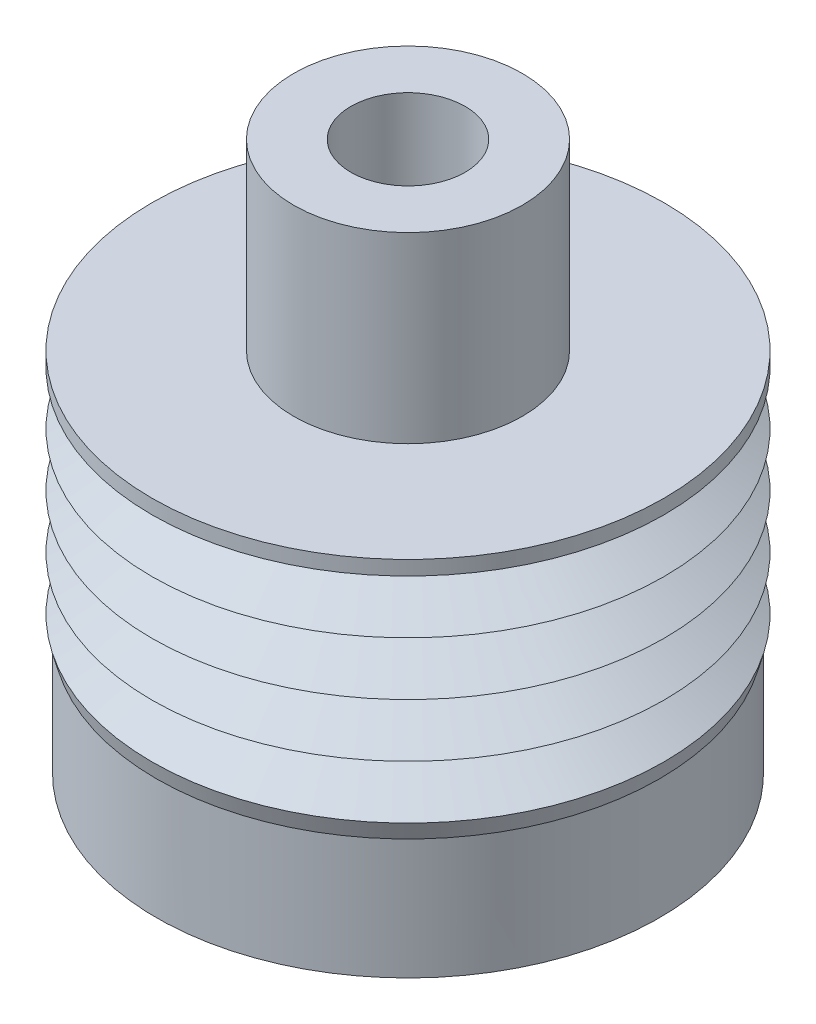
ISO-10303-21;
HEADER;
FILE_DESCRIPTION(('STEP AP214'),'2;1');
FILE_NAME('part.step','',(''),(''),'','','');
FILE_SCHEMA(('AUTOMOTIVE_DESIGN { 1 0 10303 214 1 1 1 1 }'));
ENDSEC;
DATA;
#1=APPLICATION_CONTEXT('core data for automotive mechanical design processes');
#2=APPLICATION_PROTOCOL_DEFINITION('international standard','automotive_design',2000,#1);
#3=PRODUCT_CONTEXT('',#1,'mechanical');
#4=PRODUCT('Part','Part','',(#3));
#5=PRODUCT_RELATED_PRODUCT_CATEGORY('part','',(#4));
#6=PRODUCT_DEFINITION_FORMATION('','',#4);
#7=PRODUCT_DEFINITION_CONTEXT('part definition',#1,'design');
#8=PRODUCT_DEFINITION('design','',#6,#7);
#9=PRODUCT_DEFINITION_SHAPE('','',#8);
#10=(LENGTH_UNIT() NAMED_UNIT(*) SI_UNIT(.MILLI.,.METRE.));
#11=(NAMED_UNIT(*) PLANE_ANGLE_UNIT() SI_UNIT($,.RADIAN.));
#12=(NAMED_UNIT(*) SI_UNIT($,.STERADIAN.) SOLID_ANGLE_UNIT());
#13=UNCERTAINTY_MEASURE_WITH_UNIT(LENGTH_MEASURE(1.E-05),#10,'distance_accuracy_value','');
#14=(GEOMETRIC_REPRESENTATION_CONTEXT(3) GLOBAL_UNCERTAINTY_ASSIGNED_CONTEXT((#13)) GLOBAL_UNIT_ASSIGNED_CONTEXT((#10,
#11,#12)) REPRESENTATION_CONTEXT('',''));
#15=CARTESIAN_POINT('',(0.,0.,0.));
#16=DIRECTION('',(0.,0.,1.));
#17=DIRECTION('',(1.,0.,0.));
#18=AXIS2_PLACEMENT_3D('',#15,#16,#17);
#19=CARTESIAN_POINT('',(2.5,16.,0.));
#20=DIRECTION('',(0.,1.,0.));
#21=DIRECTION('',(0.,0.,1.));
#22=AXIS2_PLACEMENT_3D('',#19,#20,#21);
#23=PLANE('',#22);
#24=CARTESIAN_POINT('',(0.,16.,0.));
#25=DIRECTION('',(0.,-1.,0.));
#26=DIRECTION('',(0.,0.,-1.));
#27=AXIS2_PLACEMENT_3D('',#24,#25,#26);
#28=CIRCLE('',#27,11.2);
#29=CARTESIAN_POINT('',(0.,16.,-11.2));
#30=VERTEX_POINT('',#29);
#31=EDGE_CURVE('E98',#30,#30,#28,.T.);
#32=ORIENTED_EDGE('',*,*,#31,.F.);
#33=EDGE_LOOP('',(#32));
#34=FACE_BOUND('',#33,.T.);
#35=CARTESIAN_POINT('',(0.,16.,0.));
#36=DIRECTION('',(0.,1.,0.));
#37=DIRECTION('',(0.,0.,1.));
#38=AXIS2_PLACEMENT_3D('',#35,#36,#37);
#39=CIRCLE('',#38,5.);
#40=CARTESIAN_POINT('',(0.,16.,5.));
#41=VERTEX_POINT('',#40);
#42=EDGE_CURVE('E107',#41,#41,#39,.T.);
#43=ORIENTED_EDGE('',*,*,#42,.F.);
#44=EDGE_LOOP('',(#43));
#45=FACE_BOUND('',#44,.T.);
#46=ADVANCED_FACE('F41',(#34,#45),#23,.T.);
#47=CARTESIAN_POINT('',(2.5,0.,0.));
#48=DIRECTION('',(0.,-1.,0.));
#49=DIRECTION('',(0.,0.,-1.));
#50=AXIS2_PLACEMENT_3D('',#47,#48,#49);
#51=PLANE('',#50);
#52=CARTESIAN_POINT('',(0.,0.,0.));
#53=DIRECTION('',(0.,-1.,0.));
#54=DIRECTION('',(0.,0.,-1.));
#55=AXIS2_PLACEMENT_3D('',#52,#53,#54);
#56=CIRCLE('',#55,11.);
#57=CARTESIAN_POINT('',(0.,0.,-11.));
#58=VERTEX_POINT('',#57);
#59=EDGE_CURVE('E55',#58,#58,#56,.T.);
#60=ORIENTED_EDGE('',*,*,#59,.T.);
#61=EDGE_LOOP('',(#60));
#62=FACE_BOUND('',#61,.T.);
#63=CARTESIAN_POINT('',(0.,0.,0.));
#64=DIRECTION('',(0.,-1.,0.));
#65=DIRECTION('',(0.,0.,-1.));
#66=AXIS2_PLACEMENT_3D('',#63,#64,#65);
#67=CIRCLE('',#66,2.5);
#68=CARTESIAN_POINT('',(0.,0.,-2.5));
#69=VERTEX_POINT('',#68);
#70=EDGE_CURVE('E102',#69,#69,#67,.T.);
#71=ORIENTED_EDGE('',*,*,#70,.F.);
#72=EDGE_LOOP('',(#71));
#73=FACE_BOUND('',#72,.T.);
#74=ADVANCED_FACE('F135',(#62,#73),#51,.T.);
#75=CARTESIAN_POINT('',(0.,0.,0.));
#76=DIRECTION('',(0.,-1.,0.));
#77=DIRECTION('',(0.,0.,-1.));
#78=AXIS2_PLACEMENT_3D('',#75,#76,#77);
#79=CYLINDRICAL_SURFACE('',#78,11.);
#80=CARTESIAN_POINT('',(0.,5.2661582604212,0.));
#81=DIRECTION('',(0.,-1.,0.));
#82=DIRECTION('',(0.,0.,-1.));
#83=AXIS2_PLACEMENT_3D('',#80,#81,#82);
#84=CIRCLE('',#83,11.);
#85=CARTESIAN_POINT('',(0.,5.2661582604212,11.));
#86=VERTEX_POINT('',#85);
#87=EDGE_CURVE('E50',#86,#86,#84,.T.);
#88=ORIENTED_EDGE('',*,*,#87,.T.);
#89=EDGE_LOOP('',(#88));
#90=FACE_BOUND('',#89,.T.);
#91=ORIENTED_EDGE('',*,*,#59,.F.);
#92=EDGE_LOOP('',(#91));
#93=FACE_BOUND('',#92,.T.);
#94=ADVANCED_FACE('F143',(#90,#93),#79,.T.);
#95=CARTESIAN_POINT('',(0.,5.89452994616205,0.));
#96=DIRECTION('',(0.,1.,0.));
#97=DIRECTION('',(0.,0.,1.));
#98=AXIS2_PLACEMENT_3D('',#95,#96,#97);
#99=CONICAL_SURFACE('',#98,11.,1.0471975511966);
#100=CARTESIAN_POINT('',(0.,6.00952994616205,0.));
#101=DIRECTION('',(0.,1.,0.));
#102=DIRECTION('',(0.,0.,1.));
#103=AXIS2_PLACEMENT_3D('',#100,#101,#102);
#104=CIRCLE('',#103,11.1991858428704);
#105=CARTESIAN_POINT('',(0.,6.00952994616205,11.1991858428704));
#106=VERTEX_POINT('',#105);
#107=EDGE_CURVE('E10',#106,#106,#104,.T.);
#108=ORIENTED_EDGE('',*,*,#107,.T.);
#109=EDGE_LOOP('',(#108));
#110=FACE_BOUND('',#109,.T.);
#111=CARTESIAN_POINT('',(0.,6.01,0.));
#112=DIRECTION('',(0.,-1.,0.));
#113=DIRECTION('',(0.,0.,-1.));
#114=AXIS2_PLACEMENT_3D('',#111,#112,#113);
#115=CIRCLE('',#114,11.2);
#116=CARTESIAN_POINT('',(0.,6.01,-11.2));
#117=VERTEX_POINT('',#116);
#118=EDGE_CURVE('E60',#117,#117,#115,.T.);
#119=ORIENTED_EDGE('',*,*,#118,.T.);
#120=EDGE_LOOP('',(#119));
#121=FACE_BOUND('',#120,.T.);
#122=ADVANCED_FACE('F184',(#110,#121),#99,.T.);
#123=CARTESIAN_POINT('',(0.,6.01,0.));
#124=DIRECTION('',(0.,-1.,0.));
#125=DIRECTION('',(0.,0.,-1.));
#126=AXIS2_PLACEMENT_3D('',#123,#124,#125);
#127=CONICAL_SURFACE('',#126,11.2,1.0471975511966);
#128=CARTESIAN_POINT('',(0.,7.18000000000001,0.));
#129=DIRECTION('',(0.,-1.,0.));
#130=DIRECTION('',(0.,0.,-1.));
#131=AXIS2_PLACEMENT_3D('',#128,#129,#130);
#132=CIRCLE('',#131,9.17350055514444);
#133=CARTESIAN_POINT('',(0.,7.18000000000001,-9.17350055514444));
#134=VERTEX_POINT('',#133);
#135=EDGE_CURVE('E66',#134,#134,#132,.T.);
#136=ORIENTED_EDGE('',*,*,#135,.T.);
#137=EDGE_LOOP('',(#136));
#138=FACE_BOUND('',#137,.T.);
#139=ORIENTED_EDGE('',*,*,#118,.F.);
#140=EDGE_LOOP('',(#139));
#141=FACE_BOUND('',#140,.T.);
#142=ADVANCED_FACE('F180',(#138,#141),#127,.T.);
#143=CARTESIAN_POINT('',(0.,7.18000000000001,0.));
#144=DIRECTION('',(0.,1.,0.));
#145=DIRECTION('',(0.,0.,1.));
#146=AXIS2_PLACEMENT_3D('',#143,#144,#145);
#147=CONICAL_SURFACE('',#146,9.17350055514444,1.0471975511966);
#148=CARTESIAN_POINT('',(0.,8.35,0.));
#149=DIRECTION('',(0.,-1.,0.));
#150=DIRECTION('',(0.,0.,-1.));
#151=AXIS2_PLACEMENT_3D('',#148,#149,#150);
#152=CIRCLE('',#151,11.2);
#153=CARTESIAN_POINT('',(0.,8.35,-11.2));
#154=VERTEX_POINT('',#153);
#155=EDGE_CURVE('E70',#154,#154,#152,.T.);
#156=ORIENTED_EDGE('',*,*,#155,.T.);
#157=EDGE_LOOP('',(#156));
#158=FACE_BOUND('',#157,.T.);
#159=ORIENTED_EDGE('',*,*,#135,.F.);
#160=EDGE_LOOP('',(#159));
#161=FACE_BOUND('',#160,.T.);
#162=ADVANCED_FACE('F176',(#158,#161),#147,.T.);
#163=CARTESIAN_POINT('',(0.,8.35,0.));
#164=DIRECTION('',(0.,-1.,0.));
#165=DIRECTION('',(0.,0.,-1.));
#166=AXIS2_PLACEMENT_3D('',#163,#164,#165);
#167=CONICAL_SURFACE('',#166,11.2,1.0471975511966);
#168=CARTESIAN_POINT('',(0.,9.52,0.));
#169=DIRECTION('',(0.,-1.,0.));
#170=DIRECTION('',(0.,0.,-1.));
#171=AXIS2_PLACEMENT_3D('',#168,#169,#170);
#172=CIRCLE('',#171,9.17350055514441);
#173=CARTESIAN_POINT('',(0.,9.52,-9.17350055514441));
#174=VERTEX_POINT('',#173);
#175=EDGE_CURVE('E74',#174,#174,#172,.T.);
#176=ORIENTED_EDGE('',*,*,#175,.T.);
#177=EDGE_LOOP('',(#176));
#178=FACE_BOUND('',#177,.T.);
#179=ORIENTED_EDGE('',*,*,#155,.F.);
#180=EDGE_LOOP('',(#179));
#181=FACE_BOUND('',#180,.T.);
#182=ADVANCED_FACE('F172',(#178,#181),#167,.T.);
#183=CARTESIAN_POINT('',(0.,9.52,0.));
#184=DIRECTION('',(0.,1.,0.));
#185=DIRECTION('',(0.,0.,1.));
#186=AXIS2_PLACEMENT_3D('',#183,#184,#185);
#187=CONICAL_SURFACE('',#186,9.17350055514441,1.0471975511966);
#188=CARTESIAN_POINT('',(0.,10.69,0.));
#189=DIRECTION('',(0.,-1.,0.));
#190=DIRECTION('',(0.,0.,-1.));
#191=AXIS2_PLACEMENT_3D('',#188,#189,#190);
#192=CIRCLE('',#191,11.2);
#193=CARTESIAN_POINT('',(0.,10.69,-11.2));
#194=VERTEX_POINT('',#193);
#195=EDGE_CURVE('E78',#194,#194,#192,.T.);
#196=ORIENTED_EDGE('',*,*,#195,.T.);
#197=EDGE_LOOP('',(#196));
#198=FACE_BOUND('',#197,.T.);
#199=ORIENTED_EDGE('',*,*,#175,.F.);
#200=EDGE_LOOP('',(#199));
#201=FACE_BOUND('',#200,.T.);
#202=ADVANCED_FACE('F168',(#198,#201),#187,.T.);
#203=CARTESIAN_POINT('',(0.,10.69,0.));
#204=DIRECTION('',(0.,-1.,0.));
#205=DIRECTION('',(0.,0.,-1.));
#206=AXIS2_PLACEMENT_3D('',#203,#204,#205);
#207=CONICAL_SURFACE('',#206,11.2,1.0471975511966);
#208=CARTESIAN_POINT('',(0.,11.86,0.));
#209=DIRECTION('',(0.,-1.,0.));
#210=DIRECTION('',(0.,0.,-1.));
#211=AXIS2_PLACEMENT_3D('',#208,#209,#210);
#212=CIRCLE('',#211,9.17350055514439);
#213=CARTESIAN_POINT('',(0.,11.86,-9.17350055514439));
#214=VERTEX_POINT('',#213);
#215=EDGE_CURVE('E82',#214,#214,#212,.T.);
#216=ORIENTED_EDGE('',*,*,#215,.T.);
#217=EDGE_LOOP('',(#216));
#218=FACE_BOUND('',#217,.T.);
#219=ORIENTED_EDGE('',*,*,#195,.F.);
#220=EDGE_LOOP('',(#219));
#221=FACE_BOUND('',#220,.T.);
#222=ADVANCED_FACE('F164',(#218,#221),#207,.T.);
#223=CARTESIAN_POINT('',(0.,11.86,0.));
#224=DIRECTION('',(0.,1.,0.));
#225=DIRECTION('',(0.,0.,1.));
#226=AXIS2_PLACEMENT_3D('',#223,#224,#225);
#227=CONICAL_SURFACE('',#226,9.17350055514439,1.0471975511966);
#228=CARTESIAN_POINT('',(0.,13.03,0.));
#229=DIRECTION('',(0.,-1.,0.));
#230=DIRECTION('',(0.,0.,-1.));
#231=AXIS2_PLACEMENT_3D('',#228,#229,#230);
#232=CIRCLE('',#231,11.2);
#233=CARTESIAN_POINT('',(0.,13.03,-11.2));
#234=VERTEX_POINT('',#233);
#235=EDGE_CURVE('E86',#234,#234,#232,.T.);
#236=ORIENTED_EDGE('',*,*,#235,.T.);
#237=EDGE_LOOP('',(#236));
#238=FACE_BOUND('',#237,.T.);
#239=ORIENTED_EDGE('',*,*,#215,.F.);
#240=EDGE_LOOP('',(#239));
#241=FACE_BOUND('',#240,.T.);
#242=ADVANCED_FACE('F160',(#238,#241),#227,.T.);
#243=CARTESIAN_POINT('',(0.,13.03,0.));
#244=DIRECTION('',(0.,-1.,0.));
#245=DIRECTION('',(0.,0.,-1.));
#246=AXIS2_PLACEMENT_3D('',#243,#244,#245);
#247=CONICAL_SURFACE('',#246,11.2,1.0471975511966);
#248=CARTESIAN_POINT('',(0.,14.2,0.));
#249=DIRECTION('',(0.,-1.,0.));
#250=DIRECTION('',(0.,0.,-1.));
#251=AXIS2_PLACEMENT_3D('',#248,#249,#250);
#252=CIRCLE('',#251,9.17350055514436);
#253=CARTESIAN_POINT('',(0.,14.2,-9.17350055514436));
#254=VERTEX_POINT('',#253);
#255=EDGE_CURVE('E90',#254,#254,#252,.T.);
#256=ORIENTED_EDGE('',*,*,#255,.T.);
#257=EDGE_LOOP('',(#256));
#258=FACE_BOUND('',#257,.T.);
#259=ORIENTED_EDGE('',*,*,#235,.F.);
#260=EDGE_LOOP('',(#259));
#261=FACE_BOUND('',#260,.T.);
#262=ADVANCED_FACE('F156',(#258,#261),#247,.T.);
#263=CARTESIAN_POINT('',(0.,14.2,0.));
#264=DIRECTION('',(0.,1.,0.));
#265=DIRECTION('',(0.,0.,1.));
#266=AXIS2_PLACEMENT_3D('',#263,#264,#265);
#267=CONICAL_SURFACE('',#266,9.17350055514436,1.0471975511966);
#268=CARTESIAN_POINT('',(0.,15.37,0.));
#269=DIRECTION('',(0.,-1.,0.));
#270=DIRECTION('',(0.,0.,-1.));
#271=AXIS2_PLACEMENT_3D('',#268,#269,#270);
#272=CIRCLE('',#271,11.2);
#273=CARTESIAN_POINT('',(0.,15.37,-11.2));
#274=VERTEX_POINT('',#273);
#275=EDGE_CURVE('E94',#274,#274,#272,.T.);
#276=ORIENTED_EDGE('',*,*,#275,.T.);
#277=EDGE_LOOP('',(#276));
#278=FACE_BOUND('',#277,.T.);
#279=ORIENTED_EDGE('',*,*,#255,.F.);
#280=EDGE_LOOP('',(#279));
#281=FACE_BOUND('',#280,.T.);
#282=ADVANCED_FACE('F152',(#278,#281),#267,.T.);
#283=CARTESIAN_POINT('',(0.,0.,0.));
#284=DIRECTION('',(0.,-1.,0.));
#285=DIRECTION('',(0.,0.,-1.));
#286=AXIS2_PLACEMENT_3D('',#283,#284,#285);
#287=CYLINDRICAL_SURFACE('',#286,11.2);
#288=ORIENTED_EDGE('',*,*,#31,.T.);
#289=EDGE_LOOP('',(#288));
#290=FACE_BOUND('',#289,.T.);
#291=ORIENTED_EDGE('',*,*,#275,.F.);
#292=EDGE_LOOP('',(#291));
#293=FACE_BOUND('',#292,.T.);
#294=ADVANCED_FACE('F149',(#290,#293),#287,.T.);
#295=CARTESIAN_POINT('',(0.,0.,0.));
#296=DIRECTION('',(0.,-1.,0.));
#297=DIRECTION('',(0.,0.,-1.));
#298=AXIS2_PLACEMENT_3D('',#295,#296,#297);
#299=CYLINDRICAL_SURFACE('',#298,2.5);
#300=ORIENTED_EDGE('',*,*,#70,.T.);
#301=EDGE_LOOP('',(#300));
#302=FACE_BOUND('',#301,.T.);
#303=CARTESIAN_POINT('',(0.,24.,0.));
#304=DIRECTION('',(0.,1.,0.));
#305=DIRECTION('',(0.,0.,1.));
#306=AXIS2_PLACEMENT_3D('',#303,#304,#305);
#307=CIRCLE('',#306,2.5);
#308=CARTESIAN_POINT('',(0.,24.,2.5));
#309=VERTEX_POINT('',#308);
#310=EDGE_CURVE('E111',#309,#309,#307,.T.);
#311=ORIENTED_EDGE('',*,*,#310,.T.);
#312=EDGE_LOOP('',(#311));
#313=FACE_BOUND('',#312,.T.);
#314=ADVANCED_FACE('F119',(#302,#313),#299,.F.);
#315=CARTESIAN_POINT('',(0.,5.2661582604212,0.));
#316=DIRECTION('',(0.,1.,0.));
#317=DIRECTION('',(0.,0.,1.));
#318=AXIS2_PLACEMENT_3D('',#315,#316,#317);
#319=CONICAL_SURFACE('',#318,11.,0.261799387799148);
#320=CARTESIAN_POINT('',(0.,6.00952994616205,11.1991858428704));
#321=CARTESIAN_POINT('',(0.,6.00178649110225,11.1971109903405));
#322=CARTESIAN_POINT('',(0.,5.99404303604245,11.1950361378106));
#323=CARTESIAN_POINT('',(0.,5.97855612592285,11.1908864327508));
#324=CARTESIAN_POINT('',(0.,5.97081267086305,11.1888115802209));
#325=CARTESIAN_POINT('',(0.,5.95532576074345,11.1846618751611));
#326=CARTESIAN_POINT('',(0.,5.94758230568365,11.1825870226312));
#327=CARTESIAN_POINT('',(0.,5.93209539556404,11.1784373175714));
#328=CARTESIAN_POINT('',(0.,5.92435194050424,11.1763624650415));
#329=CARTESIAN_POINT('',(0.,5.90886503038464,11.1722127599817));
#330=CARTESIAN_POINT('',(0.,5.90112157532484,11.1701379074518));
#331=CARTESIAN_POINT('',(0.,5.88563466520524,11.165988202392));
#332=CARTESIAN_POINT('',(0.,5.87789121014544,11.1639133498621));
#333=CARTESIAN_POINT('',(0.,5.86240430002584,11.1597636448023));
#334=CARTESIAN_POINT('',(0.,5.85466084496604,11.1576887922724));
#335=CARTESIAN_POINT('',(0.,5.83917393484644,11.1535390872126));
#336=CARTESIAN_POINT('',(0.,5.83143047978664,11.1514642346827));
#337=CARTESIAN_POINT('',(0.,5.81594356966704,11.1473145296229));
#338=CARTESIAN_POINT('',(0.,5.80820011460724,11.145239677093));
#339=CARTESIAN_POINT('',(0.,5.79271320448763,11.1410899720332));
#340=CARTESIAN_POINT('',(0.,5.78496974942783,11.1390151195033));
#341=CARTESIAN_POINT('',(0.,5.76948283930823,11.1348654144435));
#342=CARTESIAN_POINT('',(0.,5.76173938424843,11.1327905619136));
#343=CARTESIAN_POINT('',(0.,5.74625247412883,11.1286408568538));
#344=CARTESIAN_POINT('',(0.,5.73850901906903,11.1265660043239));
#345=CARTESIAN_POINT('',(0.,5.72302210894943,11.1224162992641));
#346=CARTESIAN_POINT('',(0.,5.71527865388963,11.1203414467342));
#347=CARTESIAN_POINT('',(0.,5.69979174377003,11.1161917416744));
#348=CARTESIAN_POINT('',(0.,5.69204828871023,11.1141168891445));
#349=CARTESIAN_POINT('',(0.,5.67656137859063,11.1099671840847));
#350=CARTESIAN_POINT('',(0.,5.66881792353083,11.1078923315548));
#351=CARTESIAN_POINT('',(0.,5.65333101341123,11.103742626495));
#352=CARTESIAN_POINT('',(0.,5.64558755835142,11.1016677739651));
#353=CARTESIAN_POINT('',(0.,5.63010064823182,11.0975180689053));
#354=CARTESIAN_POINT('',(0.,5.62235719317202,11.0954432163754));
#355=CARTESIAN_POINT('',(0.,5.60687028305242,11.0912935113156));
#356=CARTESIAN_POINT('',(0.,5.59912682799262,11.0892186587857));
#357=CARTESIAN_POINT('',(0.,5.58363991787302,11.0850689537259));
#358=CARTESIAN_POINT('',(0.,5.57589646281322,11.082994101196));
#359=CARTESIAN_POINT('',(0.,5.56040955269362,11.0788443961362));
#360=CARTESIAN_POINT('',(0.,5.55266609763382,11.0767695436063));
#361=CARTESIAN_POINT('',(0.,5.53717918751422,11.0726198385465));
#362=CARTESIAN_POINT('',(0.,5.52943573245442,11.0705449860166));
#363=CARTESIAN_POINT('',(0.,5.51394882233482,11.0663952809568));
#364=CARTESIAN_POINT('',(0.,5.50620536727502,11.0643204284269));
#365=CARTESIAN_POINT('',(0.,5.49071845715541,11.0601707233671));
#366=CARTESIAN_POINT('',(0.,5.48297500209561,11.0580958708372));
#367=CARTESIAN_POINT('',(0.,5.46748809197601,11.0539461657774));
#368=CARTESIAN_POINT('',(0.,5.45974463691621,11.0518713132475));
#369=CARTESIAN_POINT('',(0.,5.44425772679661,11.0477216081877));
#370=CARTESIAN_POINT('',(0.,5.43651427173681,11.0456467556578));
#371=CARTESIAN_POINT('',(0.,5.42102736161721,11.041497050598));
#372=CARTESIAN_POINT('',(0.,5.41328390655741,11.0394221980681));
#373=CARTESIAN_POINT('',(0.,5.39779699643781,11.0352724930083));
#374=CARTESIAN_POINT('',(0.,5.39005354137801,11.0331976404784));
#375=CARTESIAN_POINT('',(0.,5.37456663125841,11.0290479354186));
#376=CARTESIAN_POINT('',(0.,5.36682317619861,11.0269730828887));
#377=CARTESIAN_POINT('',(0.,5.351336266079,11.0228233778289));
#378=CARTESIAN_POINT('',(0.,5.3435928110192,11.020748525299));
#379=CARTESIAN_POINT('',(0.,5.3281059008996,11.0165988202392));
#380=CARTESIAN_POINT('',(0.,5.3203624458398,11.0145239677093));
#381=CARTESIAN_POINT('',(0.,5.3048755357202,11.0103742626495));
#382=CARTESIAN_POINT('',(0.,5.2971320806604,11.0082994101196));
#383=CARTESIAN_POINT('',(0.,5.2816451705408,11.0041497050598));
#384=CARTESIAN_POINT('',(0.,5.273901715481,11.0020748525299));
#385=CARTESIAN_POINT('',(0.,5.2661582604212,11.));
#386=B_SPLINE_CURVE_WITH_KNOTS('',3,(#320,#321,#322,#323,#324,#325,#326,#327,#328,#329,#330,
#331,#332,#333,#334,#335,#336,#337,#338,#339,#340,#341,#342,#343,#344,#345,#346,#347,#348,#349,
#350,#351,#352,#353,#354,#355,#356,#357,#358,#359,#360,#361,#362,#363,#364,#365,#366,#367,#368,
#369,#370,#371,#372,#373,#374,#375,#376,#377,#378,#379,#380,#381,#382,#383,#384,#385),
.UNSPECIFIED.,.F.,.F.,(4,2,2,2,2,2,2,2,2,2,2,2,2,2,2,2,2,2,2,2,2,2,2,2,2,2,2,2,2,2,2,2,4),(0.,
0.0240498437324622,0.0480996874649239,0.0721495311973861,0.0961993749298491,0.120249218662311,
0.144299062394773,0.168348906127236,0.192398749859699,0.21644859359216,0.240498437324623,
0.264548281057085,0.288598124789548,0.31264796852201,0.336697812254472,0.360747655986934,
0.384797499719397,0.408847343451859,0.432897187184321,0.456947030916783,0.480996874649246,
0.505046718381708,0.52909656211417,0.553146405846632,0.577196249579095,0.601246093311558,
0.62529593704402,0.649345780776482,0.673395624508945,0.697445468241407,0.721495311973869,
0.745545155706331,0.769594999438794),.UNSPECIFIED.);
#387=EDGE_CURVE('BSEAM44',#106,#86,#386,.T.);
#388=ORIENTED_EDGE('',*,*,#107,.F.);
#389=ORIENTED_EDGE('',*,*,#87,.F.);
#390=ORIENTED_EDGE('',*,*,#387,.T.);
#391=ORIENTED_EDGE('',*,*,#387,.F.);
#392=EDGE_LOOP('',(#388,#390,#389,#391));
#393=FACE_BOUND('',#392,.T.);
#394=ADVANCED_FACE('F44',(#393),#319,.T.);
#395=CARTESIAN_POINT('',(0.,24.,0.));
#396=DIRECTION('',(0.,1.,0.));
#397=DIRECTION('',(0.,0.,1.));
#398=AXIS2_PLACEMENT_3D('',#395,#396,#397);
#399=PLANE('',#398);
#400=CARTESIAN_POINT('',(0.,24.,0.));
#401=DIRECTION('',(0.,1.,0.));
#402=DIRECTION('',(0.,0.,1.));
#403=AXIS2_PLACEMENT_3D('',#400,#401,#402);
#404=CIRCLE('',#403,5.);
#405=CARTESIAN_POINT('',(0.,24.,5.));
#406=VERTEX_POINT('',#405);
#407=EDGE_CURVE('E106',#406,#406,#404,.T.);
#408=ORIENTED_EDGE('',*,*,#407,.T.);
#409=EDGE_LOOP('',(#408));
#410=FACE_BOUND('',#409,.T.);
#411=ORIENTED_EDGE('',*,*,#310,.F.);
#412=EDGE_LOOP('',(#411));
#413=FACE_BOUND('',#412,.T.);
#414=ADVANCED_FACE('F121',(#410,#413),#399,.T.);
#415=CARTESIAN_POINT('',(0.,24.,0.));
#416=DIRECTION('',(0.,-1.,0.));
#417=DIRECTION('',(0.,0.,-1.));
#418=AXIS2_PLACEMENT_3D('',#415,#416,#417);
#419=CYLINDRICAL_SURFACE('',#418,5.);
#420=ORIENTED_EDGE('',*,*,#407,.F.);
#421=EDGE_LOOP('',(#420));
#422=FACE_BOUND('',#421,.T.);
#423=ORIENTED_EDGE('',*,*,#42,.T.);
#424=EDGE_LOOP('',(#423));
#425=FACE_BOUND('',#424,.T.);
#426=ADVANCED_FACE('F123',(#422,#425),#419,.T.);
#427=CLOSED_SHELL('',(#46,#74,#94,#122,#142,#162,#182,#202,#222,#242,#262,#282,#294,#314,#394,
#414,#426));
#428=MANIFOLD_SOLID_BREP('B2',#427);
#429=ADVANCED_BREP_SHAPE_REPRESENTATION('',(#18,#428),#14);
#430=SHAPE_DEFINITION_REPRESENTATION(#9,#429);
ENDSEC;
END-ISO-10303-21;
